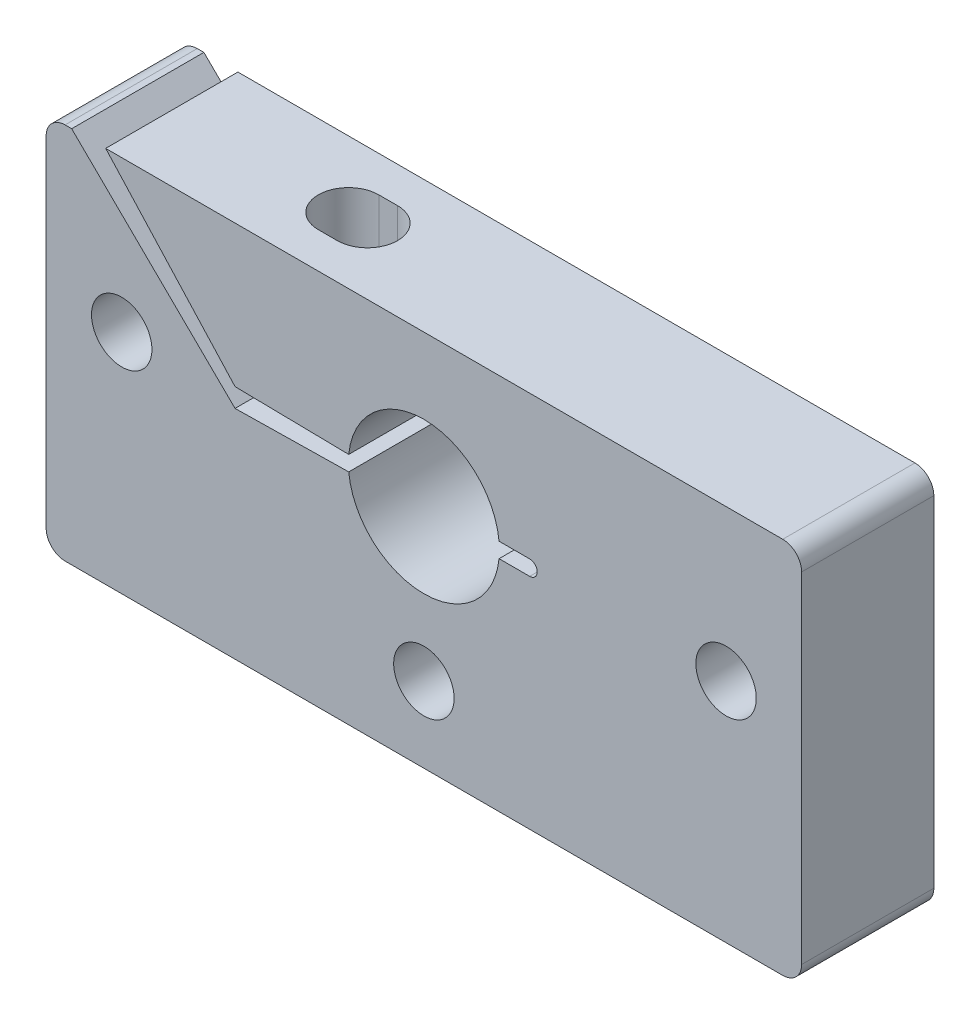
ISO-10303-21;
HEADER;
FILE_DESCRIPTION(('STEP AP214'),'2;1');
FILE_NAME('part.step','',(''),(''),'','','');
FILE_SCHEMA(('AUTOMOTIVE_DESIGN { 1 0 10303 214 1 1 1 1 }'));
ENDSEC;
DATA;
#1=APPLICATION_CONTEXT('core data for automotive mechanical design processes');
#2=APPLICATION_PROTOCOL_DEFINITION('international standard','automotive_design',2000,#1);
#3=PRODUCT_CONTEXT('',#1,'mechanical');
#4=PRODUCT('Part','Part','',(#3));
#5=PRODUCT_RELATED_PRODUCT_CATEGORY('part','',(#4));
#6=PRODUCT_DEFINITION_FORMATION('','',#4);
#7=PRODUCT_DEFINITION_CONTEXT('part definition',#1,'design');
#8=PRODUCT_DEFINITION('design','',#6,#7);
#9=PRODUCT_DEFINITION_SHAPE('','',#8);
#10=(LENGTH_UNIT() NAMED_UNIT(*) SI_UNIT(.MILLI.,.METRE.));
#11=(NAMED_UNIT(*) PLANE_ANGLE_UNIT() SI_UNIT($,.RADIAN.));
#12=(NAMED_UNIT(*) SI_UNIT($,.STERADIAN.) SOLID_ANGLE_UNIT());
#13=UNCERTAINTY_MEASURE_WITH_UNIT(LENGTH_MEASURE(1.E-05),#10,'distance_accuracy_value','');
#14=(GEOMETRIC_REPRESENTATION_CONTEXT(3) GLOBAL_UNCERTAINTY_ASSIGNED_CONTEXT((#13)) GLOBAL_UNIT_ASSIGNED_CONTEXT((#10,
#11,#12)) REPRESENTATION_CONTEXT('',''));
#15=CARTESIAN_POINT('',(0.,0.,0.));
#16=DIRECTION('',(0.,0.,1.));
#17=DIRECTION('',(1.,0.,0.));
#18=AXIS2_PLACEMENT_3D('',#15,#16,#17);
#19=CARTESIAN_POINT('',(5.6,0.,-3.5));
#20=DIRECTION('',(0.,0.,1.));
#21=DIRECTION('',(1.,0.,0.));
#22=AXIS2_PLACEMENT_3D('',#19,#20,#21);
#23=CYLINDRICAL_SURFACE('',#22,0.4);
#24=DIRECTION('',(0.,0.,-1.));
#25=VECTOR('',#24,1.);
#26=CARTESIAN_POINT('',(5.6,0.4,-3.5));
#27=LINE('',#26,#25);
#28=CARTESIAN_POINT('',(5.6,0.4,-3.5));
#29=VERTEX_POINT('',#28);
#30=CARTESIAN_POINT('',(5.6,0.4,3.5));
#31=VERTEX_POINT('',#30);
#32=EDGE_CURVE('E426',#29,#31,#27,.F.);
#33=ORIENTED_EDGE('',*,*,#32,.F.);
#34=CARTESIAN_POINT('',(5.6,0.,-3.5));
#35=DIRECTION('',(0.,0.,1.));
#36=DIRECTION('',(1.,0.,0.));
#37=AXIS2_PLACEMENT_3D('',#34,#35,#36);
#38=CIRCLE('',#37,0.4);
#39=CARTESIAN_POINT('',(5.6,-0.4,-3.5));
#40=VERTEX_POINT('',#39);
#41=EDGE_CURVE('E93',#29,#40,#38,.F.);
#42=ORIENTED_EDGE('',*,*,#41,.T.);
#43=DIRECTION('',(0.,0.,-1.));
#44=VECTOR('',#43,1.);
#45=CARTESIAN_POINT('',(5.6,-0.4,-3.5));
#46=LINE('',#45,#44);
#47=CARTESIAN_POINT('',(5.6,-0.4,3.5));
#48=VERTEX_POINT('',#47);
#49=EDGE_CURVE('E431',#48,#40,#46,.T.);
#50=ORIENTED_EDGE('',*,*,#49,.F.);
#51=CARTESIAN_POINT('',(5.6,0.,3.5));
#52=DIRECTION('',(0.,0.,1.));
#53=DIRECTION('',(1.,0.,0.));
#54=AXIS2_PLACEMENT_3D('',#51,#52,#53);
#55=CIRCLE('',#54,0.4);
#56=EDGE_CURVE('E12',#48,#31,#55,.T.);
#57=ORIENTED_EDGE('',*,*,#56,.T.);
#58=EDGE_LOOP('',(#33,#42,#50,#57));
#59=FACE_BOUND('',#58,.T.);
#60=ADVANCED_FACE('F82',(#59),#23,.F.);
#61=CARTESIAN_POINT('',(-6.98997487421324,8.001,0.));
#62=DIRECTION('',(0.,-1.,0.));
#63=DIRECTION('',(0.,0.,-1.));
#64=AXIS2_PLACEMENT_3D('',#61,#62,#63);
#65=CYLINDRICAL_SURFACE('',#64,1.6);
#66=CARTESIAN_POINT('',(-6.98997487421324,-0.450000000000001,0.));
#67=DIRECTION('',(-0.0166088657318921,0.99986206327628,0.));
#68=DIRECTION('',(-0.99986206327628,-0.0166088657318921,0.));
#69=AXIS2_PLACEMENT_3D('',#66,#67,#68);
#70=ELLIPSE('',#69,1.60022072920462,1.6);
#71=CARTESIAN_POINT('',(-8.58997487421324,-0.476577851232751,0.));
#72=VERTEX_POINT('',#71);
#73=EDGE_CURVE('E277',#72,#72,#70,.F.);
#74=ORIENTED_EDGE('',*,*,#73,.F.);
#75=EDGE_LOOP('',(#74));
#76=FACE_BOUND('',#75,.T.);
#77=CARTESIAN_POINT('',(-6.98997487421324,-6.,0.));
#78=DIRECTION('',(0.,-1.,0.));
#79=DIRECTION('',(0.,0.,-1.));
#80=AXIS2_PLACEMENT_3D('',#77,#78,#79);
#81=CIRCLE('',#80,1.6);
#82=CARTESIAN_POINT('',(-6.98997487421324,-6.,-1.6));
#83=VERTEX_POINT('',#82);
#84=EDGE_CURVE('E249',#83,#83,#81,.T.);
#85=ORIENTED_EDGE('',*,*,#84,.T.);
#86=EDGE_LOOP('',(#85));
#87=FACE_BOUND('',#86,.T.);
#88=ADVANCED_FACE('F508',(#76,#87),#65,.F.);
#89=CARTESIAN_POINT('',(0.,0.,-3.5));
#90=DIRECTION('',(0.,0.,1.));
#91=DIRECTION('',(1.,0.,0.));
#92=AXIS2_PLACEMENT_3D('',#89,#90,#91);
#93=CYLINDRICAL_SURFACE('',#92,4.);
#94=DIRECTION('',(0.,0.,1.));
#95=VECTOR('',#94,1.);
#96=CARTESIAN_POINT('',(3.97994974842648,0.4,-3.5));
#97=LINE('',#96,#95);
#98=CARTESIAN_POINT('',(3.97994974842648,0.4,-3.5));
#99=VERTEX_POINT('',#98);
#100=CARTESIAN_POINT('',(3.97994974842648,0.4,3.5));
#101=VERTEX_POINT('',#100);
#102=EDGE_CURVE('E372',#99,#101,#97,.T.);
#103=ORIENTED_EDGE('',*,*,#102,.T.);
#104=CARTESIAN_POINT('',(0.,0.,3.5));
#105=DIRECTION('',(0.,0.,-1.));
#106=DIRECTION('',(1.,0.,0.));
#107=AXIS2_PLACEMENT_3D('',#104,#105,#106);
#108=CIRCLE('',#107,4.);
#109=CARTESIAN_POINT('',(-3.97994974842648,0.4,3.5));
#110=VERTEX_POINT('',#109);
#111=EDGE_CURVE('E292',#110,#101,#108,.T.);
#112=ORIENTED_EDGE('',*,*,#111,.F.);
#113=DIRECTION('',(0.,0.,1.));
#114=VECTOR('',#113,1.);
#115=CARTESIAN_POINT('',(-3.97994974842648,0.4,-3.5));
#116=LINE('',#115,#114);
#117=CARTESIAN_POINT('',(-3.97994974842648,0.4,-3.5));
#118=VERTEX_POINT('',#117);
#119=EDGE_CURVE('E374',#118,#110,#116,.T.);
#120=ORIENTED_EDGE('',*,*,#119,.F.);
#121=CARTESIAN_POINT('',(0.,0.,-3.5));
#122=DIRECTION('',(0.,0.,-1.));
#123=DIRECTION('',(1.,0.,0.));
#124=AXIS2_PLACEMENT_3D('',#121,#122,#123);
#125=CIRCLE('',#124,4.);
#126=EDGE_CURVE('E340',#118,#99,#125,.T.);
#127=ORIENTED_EDGE('',*,*,#126,.T.);
#128=EDGE_LOOP('',(#103,#112,#120,#127));
#129=FACE_BOUND('',#128,.T.);
#130=ADVANCED_FACE('F502',(#129),#93,.F.);
#131=CARTESIAN_POINT('',(-10.,0.5,-3.5));
#132=DIRECTION('',(-0.0166088657318921,-0.99986206327628,0.));
#133=DIRECTION('',(0.99986206327628,-0.0166088657318921,0.));
#134=AXIS2_PLACEMENT_3D('',#131,#132,#133);
#135=PLANE('',#134);
#136=CARTESIAN_POINT('',(-7.48997487421324,0.458305578510235,0.));
#137=DIRECTION('',(-0.0166088657318921,-0.99986206327628,0.));
#138=DIRECTION('',(-0.99986206327628,0.0166088657318921,0.));
#139=AXIS2_PLACEMENT_3D('',#136,#137,#138);
#140=ELLIPSE('',#139,1.60022072920462,1.6);
#141=CARTESIAN_POINT('',(-7.48997487421324,0.458305578510237,-1.6));
#142=VERTEX_POINT('',#141);
#143=CARTESIAN_POINT('',(-7.48997487421324,0.458305578510237,1.6));
#144=VERTEX_POINT('',#143);
#145=EDGE_CURVE('E236',#142,#144,#140,.F.);
#146=ORIENTED_EDGE('',*,*,#145,.T.);
#147=DIRECTION('',(0.99986206327628,-0.0166088657318921,0.));
#148=VECTOR('',#147,1.);
#149=CARTESIAN_POINT('',(-7.28306848467389,0.45486862398506,1.6));
#150=LINE('',#149,#148);
#151=CARTESIAN_POINT('',(-6.48997487421324,0.441694421489766,1.6));
#152=VERTEX_POINT('',#151);
#153=EDGE_CURVE('E262',#144,#152,#150,.T.);
#154=ORIENTED_EDGE('',*,*,#153,.T.);
#155=CARTESIAN_POINT('',(-6.48997487421324,0.441694421489768,0.));
#156=DIRECTION('',(-0.0166088657318921,-0.99986206327628,0.));
#157=DIRECTION('',(-0.99986206327628,0.0166088657318921,0.));
#158=AXIS2_PLACEMENT_3D('',#155,#156,#157);
#159=ELLIPSE('',#158,1.60022072920462,1.6);
#160=CARTESIAN_POINT('',(-6.48997487421324,0.441694421489768,-1.6));
#161=VERTEX_POINT('',#160);
#162=EDGE_CURVE('E237',#152,#161,#159,.F.);
#163=ORIENTED_EDGE('',*,*,#162,.T.);
#164=DIRECTION('',(-0.99986206327628,0.0166088657318921,0.));
#165=VECTOR('',#164,1.);
#166=CARTESIAN_POINT('',(-7.28306848467389,0.45486862398506,-1.6));
#167=LINE('',#166,#165);
#168=EDGE_CURVE('E239',#161,#142,#167,.T.);
#169=ORIENTED_EDGE('',*,*,#168,.T.);
#170=EDGE_LOOP('',(#146,#154,#163,#169));
#171=FACE_BOUND('',#170,.T.);
#172=ORIENTED_EDGE('',*,*,#119,.T.);
#173=DIRECTION('',(0.99986206327628,-0.0166088657318921,0.));
#174=VECTOR('',#173,1.);
#175=CARTESIAN_POINT('',(-10.,0.5,3.5));
#176=LINE('',#175,#174);
#177=CARTESIAN_POINT('',(-10.,0.5,3.5));
#178=VERTEX_POINT('',#177);
#179=EDGE_CURVE('E324',#178,#110,#176,.T.);
#180=ORIENTED_EDGE('',*,*,#179,.F.);
#181=DIRECTION('',(0.,0.,1.));
#182=VECTOR('',#181,1.);
#183=CARTESIAN_POINT('',(-10.,0.5,-3.5));
#184=LINE('',#183,#182);
#185=CARTESIAN_POINT('',(-10.,0.5,-3.5));
#186=VERTEX_POINT('',#185);
#187=EDGE_CURVE('E377',#186,#178,#184,.T.);
#188=ORIENTED_EDGE('',*,*,#187,.F.);
#189=DIRECTION('',(0.99986206327628,-0.0166088657318921,0.));
#190=VECTOR('',#189,1.);
#191=CARTESIAN_POINT('',(-10.,0.5,-3.5));
#192=LINE('',#191,#190);
#193=EDGE_CURVE('E371',#186,#118,#192,.T.);
#194=ORIENTED_EDGE('',*,*,#193,.T.);
#195=EDGE_LOOP('',(#172,#180,#188,#194));
#196=FACE_BOUND('',#195,.T.);
#197=ADVANCED_FACE('F499',(#171,#196),#135,.T.);
#198=CARTESIAN_POINT('',(-10.,0.5,-3.5));
#199=DIRECTION('',(-0.73845534062588,-0.674302387583728,0.));
#200=DIRECTION('',(0.674302387583728,-0.73845534062588,0.));
#201=AXIS2_PLACEMENT_3D('',#198,#199,#200);
#202=PLANE('',#201);
#203=ORIENTED_EDGE('',*,*,#187,.T.);
#204=DIRECTION('',(0.674302387583728,-0.73845534062588,0.));
#205=VECTOR('',#204,1.);
#206=CARTESIAN_POINT('',(-10.,0.5,3.5));
#207=LINE('',#206,#205);
#208=CARTESIAN_POINT('',(-16.8484411021954,8.,3.5));
#209=VERTEX_POINT('',#208);
#210=EDGE_CURVE('E325',#209,#178,#207,.T.);
#211=ORIENTED_EDGE('',*,*,#210,.F.);
#212=DIRECTION('',(0.,0.,1.));
#213=VECTOR('',#212,1.);
#214=CARTESIAN_POINT('',(-16.8484411021954,8.,-3.5));
#215=LINE('',#214,#213);
#216=CARTESIAN_POINT('',(-16.8484411021954,8.,-3.5));
#217=VERTEX_POINT('',#216);
#218=EDGE_CURVE('E379',#217,#209,#215,.T.);
#219=ORIENTED_EDGE('',*,*,#218,.F.);
#220=DIRECTION('',(0.674302387583728,-0.73845534062588,0.));
#221=VECTOR('',#220,1.);
#222=CARTESIAN_POINT('',(-10.,0.5,-3.5));
#223=LINE('',#222,#221);
#224=EDGE_CURVE('E368',#217,#186,#223,.T.);
#225=ORIENTED_EDGE('',*,*,#224,.T.);
#226=EDGE_LOOP('',(#203,#211,#219,#225));
#227=FACE_BOUND('',#226,.T.);
#228=ADVANCED_FACE('F496',(#227),#202,.T.);
#229=CARTESIAN_POINT('',(-16.8484411021954,8.,-3.5));
#230=DIRECTION('',(0.,1.,0.));
#231=DIRECTION('',(-1.,0.,0.));
#232=AXIS2_PLACEMENT_3D('',#229,#230,#231);
#233=PLANE('',#232);
#234=CARTESIAN_POINT('',(-7.48997487421324,8.,0.));
#235=DIRECTION('',(0.,1.,0.));
#236=DIRECTION('',(0.,0.,1.));
#237=AXIS2_PLACEMENT_3D('',#234,#235,#236);
#238=CIRCLE('',#237,1.6);
#239=CARTESIAN_POINT('',(-7.48997487421324,8.,-1.6));
#240=VERTEX_POINT('',#239);
#241=CARTESIAN_POINT('',(-7.48997487421324,8.,1.6));
#242=VERTEX_POINT('',#241);
#243=EDGE_CURVE('E231',#240,#242,#238,.T.);
#244=ORIENTED_EDGE('',*,*,#243,.F.);
#245=DIRECTION('',(-1.,0.,0.));
#246=VECTOR('',#245,1.);
#247=CARTESIAN_POINT('',(-7.48997487421324,8.,-1.6));
#248=LINE('',#247,#246);
#249=CARTESIAN_POINT('',(-6.48997487421324,8.,-1.6));
#250=VERTEX_POINT('',#249);
#251=EDGE_CURVE('E243',#250,#240,#248,.T.);
#252=ORIENTED_EDGE('',*,*,#251,.F.);
#253=CARTESIAN_POINT('',(-6.48997487421324,8.,0.));
#254=DIRECTION('',(0.,1.,0.));
#255=DIRECTION('',(0.,0.,1.));
#256=AXIS2_PLACEMENT_3D('',#253,#254,#255);
#257=CIRCLE('',#256,1.6);
#258=CARTESIAN_POINT('',(-6.48997487421324,8.,1.6));
#259=VERTEX_POINT('',#258);
#260=EDGE_CURVE('E252',#259,#250,#257,.T.);
#261=ORIENTED_EDGE('',*,*,#260,.F.);
#262=DIRECTION('',(1.,0.,0.));
#263=VECTOR('',#262,1.);
#264=CARTESIAN_POINT('',(-7.48997487421324,8.,1.6));
#265=LINE('',#264,#263);
#266=EDGE_CURVE('E260',#242,#259,#265,.T.);
#267=ORIENTED_EDGE('',*,*,#266,.F.);
#268=EDGE_LOOP('',(#244,#252,#261,#267));
#269=FACE_BOUND('',#268,.T.);
#270=DIRECTION('',(-1.,0.,0.));
#271=VECTOR('',#270,1.);
#272=CARTESIAN_POINT('',(-16.8484411021954,8.,3.5));
#273=LINE('',#272,#271);
#274=CARTESIAN_POINT('',(19.,8.,3.5));
#275=VERTEX_POINT('',#274);
#276=EDGE_CURVE('E318',#275,#209,#273,.T.);
#277=ORIENTED_EDGE('',*,*,#276,.F.);
#278=DIRECTION('',(0.,0.,1.));
#279=VECTOR('',#278,1.);
#280=CARTESIAN_POINT('',(19.,8.,-3.5));
#281=LINE('',#280,#279);
#282=CARTESIAN_POINT('',(19.,8.,-3.5));
#283=VERTEX_POINT('',#282);
#284=EDGE_CURVE('E421',#275,#283,#281,.F.);
#285=ORIENTED_EDGE('',*,*,#284,.T.);
#286=DIRECTION('',(-1.,0.,0.));
#287=VECTOR('',#286,1.);
#288=CARTESIAN_POINT('',(-16.8484411021954,8.,-3.5));
#289=LINE('',#288,#287);
#290=EDGE_CURVE('E366',#283,#217,#289,.T.);
#291=ORIENTED_EDGE('',*,*,#290,.T.);
#292=ORIENTED_EDGE('',*,*,#218,.T.);
#293=EDGE_LOOP('',(#277,#285,#291,#292));
#294=FACE_BOUND('',#293,.T.);
#295=ADVANCED_FACE('F251',(#269,#294),#233,.T.);
#296=CARTESIAN_POINT('',(20.,8.,-3.5));
#297=DIRECTION('',(1.,0.,0.));
#298=DIRECTION('',(0.,1.,0.));
#299=AXIS2_PLACEMENT_3D('',#296,#297,#298);
#300=PLANE('',#299);
#301=DIRECTION('',(0.,1.,0.));
#302=VECTOR('',#301,1.);
#303=CARTESIAN_POINT('',(20.,8.,3.5));
#304=LINE('',#303,#302);
#305=CARTESIAN_POINT('',(20.,-11.,3.5));
#306=VERTEX_POINT('',#305);
#307=CARTESIAN_POINT('',(20.,7.,3.5));
#308=VERTEX_POINT('',#307);
#309=EDGE_CURVE('E320',#306,#308,#304,.T.);
#310=ORIENTED_EDGE('',*,*,#309,.F.);
#311=DIRECTION('',(0.,0.,1.));
#312=VECTOR('',#311,1.);
#313=CARTESIAN_POINT('',(20.,-11.,-3.5));
#314=LINE('',#313,#312);
#315=CARTESIAN_POINT('',(20.,-11.,-3.5));
#316=VERTEX_POINT('',#315);
#317=EDGE_CURVE('E423',#306,#316,#314,.F.);
#318=ORIENTED_EDGE('',*,*,#317,.T.);
#319=DIRECTION('',(0.,1.,0.));
#320=VECTOR('',#319,1.);
#321=CARTESIAN_POINT('',(20.,8.,-3.5));
#322=LINE('',#321,#320);
#323=CARTESIAN_POINT('',(20.,7.,-3.5));
#324=VERTEX_POINT('',#323);
#325=EDGE_CURVE('E361',#316,#324,#322,.T.);
#326=ORIENTED_EDGE('',*,*,#325,.T.);
#327=DIRECTION('',(0.,0.,1.));
#328=VECTOR('',#327,1.);
#329=CARTESIAN_POINT('',(20.,7.,-3.5));
#330=LINE('',#329,#328);
#331=EDGE_CURVE('E416',#324,#308,#330,.T.);
#332=ORIENTED_EDGE('',*,*,#331,.T.);
#333=EDGE_LOOP('',(#310,#318,#326,#332));
#334=FACE_BOUND('',#333,.T.);
#335=ADVANCED_FACE('F481',(#334),#300,.T.);
#336=CARTESIAN_POINT('',(-20.,-12.,-3.5));
#337=DIRECTION('',(0.,-1.,0.));
#338=DIRECTION('',(1.,0.,0.));
#339=AXIS2_PLACEMENT_3D('',#336,#337,#338);
#340=PLANE('',#339);
#341=CARTESIAN_POINT('',(-6.98997487421324,-12.,0.));
#342=DIRECTION('',(0.,-1.,0.));
#343=DIRECTION('',(0.,0.,-1.));
#344=AXIS2_PLACEMENT_3D('',#341,#342,#343);
#345=CIRCLE('',#344,2.2);
#346=CARTESIAN_POINT('',(-6.98997487421324,-12.,-2.2));
#347=VERTEX_POINT('',#346);
#348=EDGE_CURVE('E274',#347,#347,#345,.T.);
#349=ORIENTED_EDGE('',*,*,#348,.F.);
#350=EDGE_LOOP('',(#349));
#351=FACE_BOUND('',#350,.T.);
#352=DIRECTION('',(1.,0.,0.));
#353=VECTOR('',#352,1.);
#354=CARTESIAN_POINT('',(-20.,-12.,3.5));
#355=LINE('',#354,#353);
#356=CARTESIAN_POINT('',(-19.,-12.,3.5));
#357=VERTEX_POINT('',#356);
#358=CARTESIAN_POINT('',(19.,-12.,3.5));
#359=VERTEX_POINT('',#358);
#360=EDGE_CURVE('E313',#357,#359,#355,.T.);
#361=ORIENTED_EDGE('',*,*,#360,.F.);
#362=DIRECTION('',(0.,0.,1.));
#363=VECTOR('',#362,1.);
#364=CARTESIAN_POINT('',(-19.,-12.,-3.5));
#365=LINE('',#364,#363);
#366=CARTESIAN_POINT('',(-19.,-12.,-3.5));
#367=VERTEX_POINT('',#366);
#368=EDGE_CURVE('E407',#357,#367,#365,.F.);
#369=ORIENTED_EDGE('',*,*,#368,.T.);
#370=DIRECTION('',(1.,0.,0.));
#371=VECTOR('',#370,1.);
#372=CARTESIAN_POINT('',(-20.,-12.,-3.5));
#373=LINE('',#372,#371);
#374=CARTESIAN_POINT('',(19.,-12.,-3.5));
#375=VERTEX_POINT('',#374);
#376=EDGE_CURVE('E359',#367,#375,#373,.T.);
#377=ORIENTED_EDGE('',*,*,#376,.T.);
#378=DIRECTION('',(0.,0.,1.));
#379=VECTOR('',#378,1.);
#380=CARTESIAN_POINT('',(19.,-12.,-3.5));
#381=LINE('',#380,#379);
#382=EDGE_CURVE('E403',#375,#359,#381,.T.);
#383=ORIENTED_EDGE('',*,*,#382,.T.);
#384=EDGE_LOOP('',(#361,#369,#377,#383));
#385=FACE_BOUND('',#384,.T.);
#386=ADVANCED_FACE('F474',(#351,#385),#340,.T.);
#387=CARTESIAN_POINT('',(-20.,8.,-3.5));
#388=DIRECTION('',(-1.,0.,0.));
#389=DIRECTION('',(0.,-1.,0.));
#390=AXIS2_PLACEMENT_3D('',#387,#388,#389);
#391=PLANE('',#390);
#392=DIRECTION('',(0.,-1.,0.));
#393=VECTOR('',#392,1.);
#394=CARTESIAN_POINT('',(-20.,8.,-3.5));
#395=LINE('',#394,#393);
#396=CARTESIAN_POINT('',(-20.,7.,-3.5));
#397=VERTEX_POINT('',#396);
#398=CARTESIAN_POINT('',(-20.,-11.,-3.5));
#399=VERTEX_POINT('',#398);
#400=EDGE_CURVE('E357',#397,#399,#395,.T.);
#401=ORIENTED_EDGE('',*,*,#400,.T.);
#402=DIRECTION('',(0.,0.,1.));
#403=VECTOR('',#402,1.);
#404=CARTESIAN_POINT('',(-20.,-11.,-3.5));
#405=LINE('',#404,#403);
#406=CARTESIAN_POINT('',(-20.,-11.,3.5));
#407=VERTEX_POINT('',#406);
#408=EDGE_CURVE('E391',#399,#407,#405,.T.);
#409=ORIENTED_EDGE('',*,*,#408,.T.);
#410=DIRECTION('',(0.,-1.,0.));
#411=VECTOR('',#410,1.);
#412=CARTESIAN_POINT('',(-20.,8.,3.5));
#413=LINE('',#412,#411);
#414=CARTESIAN_POINT('',(-20.,7.,3.5));
#415=VERTEX_POINT('',#414);
#416=EDGE_CURVE('E311',#415,#407,#413,.T.);
#417=ORIENTED_EDGE('',*,*,#416,.F.);
#418=DIRECTION('',(0.,0.,1.));
#419=VECTOR('',#418,1.);
#420=CARTESIAN_POINT('',(-20.,7.,-3.5));
#421=LINE('',#420,#419);
#422=EDGE_CURVE('E380',#415,#397,#421,.F.);
#423=ORIENTED_EDGE('',*,*,#422,.T.);
#424=EDGE_LOOP('',(#401,#409,#417,#423));
#425=FACE_BOUND('',#424,.T.);
#426=ADVANCED_FACE('F470',(#425),#391,.T.);
#427=CARTESIAN_POINT('',(-20.,8.,-3.5));
#428=DIRECTION('',(0.,1.,0.));
#429=DIRECTION('',(0.,0.,1.));
#430=AXIS2_PLACEMENT_3D('',#427,#428,#429);
#431=PLANE('',#430);
#432=DIRECTION('',(-1.,0.,0.));
#433=VECTOR('',#432,1.);
#434=CARTESIAN_POINT('',(-20.,8.,-3.5));
#435=LINE('',#434,#433);
#436=CARTESIAN_POINT('',(-18.6496628402632,8.,-3.5));
#437=VERTEX_POINT('',#436);
#438=CARTESIAN_POINT('',(-19.,8.,-3.5));
#439=VERTEX_POINT('',#438);
#440=EDGE_CURVE('E352',#437,#439,#435,.T.);
#441=ORIENTED_EDGE('',*,*,#440,.T.);
#442=DIRECTION('',(0.,0.,1.));
#443=VECTOR('',#442,1.);
#444=CARTESIAN_POINT('',(-19.,8.,-3.5));
#445=LINE('',#444,#443);
#446=CARTESIAN_POINT('',(-19.,8.,3.5));
#447=VERTEX_POINT('',#446);
#448=EDGE_CURVE('E424',#439,#447,#445,.T.);
#449=ORIENTED_EDGE('',*,*,#448,.T.);
#450=DIRECTION('',(-1.,0.,0.));
#451=VECTOR('',#450,1.);
#452=CARTESIAN_POINT('',(-20.,8.,3.5));
#453=LINE('',#452,#451);
#454=CARTESIAN_POINT('',(-18.6496628402632,8.,3.5));
#455=VERTEX_POINT('',#454);
#456=EDGE_CURVE('E308',#455,#447,#453,.T.);
#457=ORIENTED_EDGE('',*,*,#456,.F.);
#458=DIRECTION('',(0.,0.,1.));
#459=VECTOR('',#458,1.);
#460=CARTESIAN_POINT('',(-18.6496628402632,8.,-3.5));
#461=LINE('',#460,#459);
#462=EDGE_CURVE('E384',#437,#455,#461,.T.);
#463=ORIENTED_EDGE('',*,*,#462,.F.);
#464=EDGE_LOOP('',(#441,#449,#457,#463));
#465=FACE_BOUND('',#464,.T.);
#466=ADVANCED_FACE('F458',(#465),#431,.T.);
#467=CARTESIAN_POINT('',(-10.,-0.5,-3.5));
#468=DIRECTION('',(0.700909264299847,0.713250449154186,0.));
#469=DIRECTION('',(-0.713250449154186,0.700909264299847,0.));
#470=AXIS2_PLACEMENT_3D('',#467,#468,#469);
#471=PLANE('',#470);
#472=ORIENTED_EDGE('',*,*,#462,.T.);
#473=DIRECTION('',(-0.713250449154186,0.700909264299847,0.));
#474=VECTOR('',#473,1.);
#475=CARTESIAN_POINT('',(-10.,-0.5,3.5));
#476=LINE('',#475,#474);
#477=CARTESIAN_POINT('',(-10.,-0.5,3.5));
#478=VERTEX_POINT('',#477);
#479=EDGE_CURVE('E304',#478,#455,#476,.T.);
#480=ORIENTED_EDGE('',*,*,#479,.F.);
#481=DIRECTION('',(0.,0.,1.));
#482=VECTOR('',#481,1.);
#483=CARTESIAN_POINT('',(-10.,-0.5,-3.5));
#484=LINE('',#483,#482);
#485=CARTESIAN_POINT('',(-10.,-0.5,-3.5));
#486=VERTEX_POINT('',#485);
#487=EDGE_CURVE('E383',#486,#478,#484,.T.);
#488=ORIENTED_EDGE('',*,*,#487,.F.);
#489=DIRECTION('',(-0.713250449154186,0.700909264299847,0.));
#490=VECTOR('',#489,1.);
#491=CARTESIAN_POINT('',(-10.,-0.5,-3.5));
#492=LINE('',#491,#490);
#493=EDGE_CURVE('E353',#486,#437,#492,.T.);
#494=ORIENTED_EDGE('',*,*,#493,.T.);
#495=EDGE_LOOP('',(#472,#480,#488,#494));
#496=FACE_BOUND('',#495,.T.);
#497=ADVANCED_FACE('F453',(#496),#471,.T.);
#498=CARTESIAN_POINT('',(-10.,-0.5,-3.5));
#499=DIRECTION('',(-0.0166088657318921,0.99986206327628,0.));
#500=DIRECTION('',(-0.99986206327628,-0.0166088657318921,0.));
#501=AXIS2_PLACEMENT_3D('',#498,#499,#500);
#502=PLANE('',#501);
#503=ORIENTED_EDGE('',*,*,#73,.T.);
#504=EDGE_LOOP('',(#503));
#505=FACE_BOUND('',#504,.T.);
#506=ORIENTED_EDGE('',*,*,#487,.T.);
#507=DIRECTION('',(-0.99986206327628,-0.0166088657318921,0.));
#508=VECTOR('',#507,1.);
#509=CARTESIAN_POINT('',(-10.,-0.5,3.5));
#510=LINE('',#509,#508);
#511=CARTESIAN_POINT('',(-3.97994974842648,-0.399999999999999,3.5));
#512=VERTEX_POINT('',#511);
#513=EDGE_CURVE('E305',#512,#478,#510,.T.);
#514=ORIENTED_EDGE('',*,*,#513,.F.);
#515=DIRECTION('',(0.,0.,1.));
#516=VECTOR('',#515,1.);
#517=CARTESIAN_POINT('',(-3.97994974842648,-0.399999999999999,-3.5));
#518=LINE('',#517,#516);
#519=CARTESIAN_POINT('',(-3.97994974842648,-0.399999999999999,-3.5));
#520=VERTEX_POINT('',#519);
#521=EDGE_CURVE('E390',#520,#512,#518,.T.);
#522=ORIENTED_EDGE('',*,*,#521,.F.);
#523=DIRECTION('',(-0.99986206327628,-0.0166088657318921,0.));
#524=VECTOR('',#523,1.);
#525=CARTESIAN_POINT('',(-10.,-0.5,-3.5));
#526=LINE('',#525,#524);
#527=EDGE_CURVE('E350',#520,#486,#526,.T.);
#528=ORIENTED_EDGE('',*,*,#527,.T.);
#529=EDGE_LOOP('',(#506,#514,#522,#528));
#530=FACE_BOUND('',#529,.T.);
#531=ADVANCED_FACE('F455',(#505,#530),#502,.T.);
#532=CARTESIAN_POINT('',(0.,0.,-3.5));
#533=DIRECTION('',(0.,0.,1.));
#534=DIRECTION('',(1.,0.,0.));
#535=AXIS2_PLACEMENT_3D('',#532,#533,#534);
#536=CYLINDRICAL_SURFACE('',#535,4.);
#537=ORIENTED_EDGE('',*,*,#521,.T.);
#538=CARTESIAN_POINT('',(0.,0.,3.5));
#539=DIRECTION('',(0.,0.,-1.));
#540=DIRECTION('',(1.,0.,0.));
#541=AXIS2_PLACEMENT_3D('',#538,#539,#540);
#542=CIRCLE('',#541,4.);
#543=CARTESIAN_POINT('',(3.97994974842648,-0.4,3.5));
#544=VERTEX_POINT('',#543);
#545=EDGE_CURVE('E299',#544,#512,#542,.T.);
#546=ORIENTED_EDGE('',*,*,#545,.F.);
#547=DIRECTION('',(0.,0.,1.));
#548=VECTOR('',#547,1.);
#549=CARTESIAN_POINT('',(3.97994974842648,-0.4,-3.5));
#550=LINE('',#549,#548);
#551=CARTESIAN_POINT('',(3.97994974842648,-0.4,-3.5));
#552=VERTEX_POINT('',#551);
#553=EDGE_CURVE('E388',#552,#544,#550,.T.);
#554=ORIENTED_EDGE('',*,*,#553,.F.);
#555=CARTESIAN_POINT('',(0.,0.,-3.5));
#556=DIRECTION('',(0.,0.,-1.));
#557=DIRECTION('',(1.,0.,0.));
#558=AXIS2_PLACEMENT_3D('',#555,#556,#557);
#559=CIRCLE('',#558,4.);
#560=EDGE_CURVE('E344',#552,#520,#559,.T.);
#561=ORIENTED_EDGE('',*,*,#560,.T.);
#562=EDGE_LOOP('',(#537,#546,#554,#561));
#563=FACE_BOUND('',#562,.T.);
#564=ADVANCED_FACE('F444',(#563),#536,.F.);
#565=CARTESIAN_POINT('',(3.97994974842648,-0.4,-3.5));
#566=DIRECTION('',(0.,1.,0.));
#567=DIRECTION('',(0.,0.,1.));
#568=AXIS2_PLACEMENT_3D('',#565,#566,#567);
#569=PLANE('',#568);
#570=DIRECTION('',(-1.,0.,0.));
#571=VECTOR('',#570,1.);
#572=CARTESIAN_POINT('',(3.97994974842648,-0.4,3.5));
#573=LINE('',#572,#571);
#574=EDGE_CURVE('E300',#48,#544,#573,.T.);
#575=ORIENTED_EDGE('',*,*,#574,.F.);
#576=ORIENTED_EDGE('',*,*,#49,.T.);
#577=DIRECTION('',(-1.,0.,0.));
#578=VECTOR('',#577,1.);
#579=CARTESIAN_POINT('',(3.97994974842648,-0.4,-3.5));
#580=LINE('',#579,#578);
#581=EDGE_CURVE('E342',#40,#552,#580,.T.);
#582=ORIENTED_EDGE('',*,*,#581,.T.);
#583=ORIENTED_EDGE('',*,*,#553,.T.);
#584=EDGE_LOOP('',(#575,#576,#582,#583));
#585=FACE_BOUND('',#584,.T.);
#586=ADVANCED_FACE('F434',(#585),#569,.T.);
#587=CARTESIAN_POINT('',(3.97994974842648,0.4,-3.5));
#588=DIRECTION('',(0.,-1.,0.));
#589=DIRECTION('',(0.,0.,-1.));
#590=AXIS2_PLACEMENT_3D('',#587,#588,#589);
#591=PLANE('',#590);
#592=DIRECTION('',(1.,0.,0.));
#593=VECTOR('',#592,1.);
#594=CARTESIAN_POINT('',(3.97994974842648,0.4,-3.5));
#595=LINE('',#594,#593);
#596=EDGE_CURVE('E338',#99,#29,#595,.T.);
#597=ORIENTED_EDGE('',*,*,#596,.T.);
#598=ORIENTED_EDGE('',*,*,#32,.T.);
#599=DIRECTION('',(1.,0.,0.));
#600=VECTOR('',#599,1.);
#601=CARTESIAN_POINT('',(3.97994974842648,0.4,3.5));
#602=LINE('',#601,#600);
#603=EDGE_CURVE('E294',#101,#31,#602,.T.);
#604=ORIENTED_EDGE('',*,*,#603,.F.);
#605=ORIENTED_EDGE('',*,*,#102,.F.);
#606=EDGE_LOOP('',(#597,#598,#604,#605));
#607=FACE_BOUND('',#606,.T.);
#608=ADVANCED_FACE('F506',(#607),#591,.T.);
#609=CARTESIAN_POINT('',(0.,0.,-3.5));
#610=DIRECTION('',(0.,0.,1.));
#611=DIRECTION('',(1.,0.,0.));
#612=AXIS2_PLACEMENT_3D('',#609,#610,#611);
#613=PLANE('',#612);
#614=CARTESIAN_POINT('',(0.,-8.,-3.5));
#615=DIRECTION('',(0.,0.,1.));
#616=DIRECTION('',(1.,0.,0.));
#617=AXIS2_PLACEMENT_3D('',#614,#615,#616);
#618=CIRCLE('',#617,1.6);
#619=CARTESIAN_POINT('',(1.6,-8.,-3.5));
#620=VERTEX_POINT('',#619);
#621=EDGE_CURVE('E330',#620,#620,#618,.T.);
#622=ORIENTED_EDGE('',*,*,#621,.T.);
#623=EDGE_LOOP('',(#622));
#624=FACE_BOUND('',#623,.T.);
#625=CARTESIAN_POINT('',(16.,0.,-3.5));
#626=DIRECTION('',(0.,0.,1.));
#627=DIRECTION('',(-1.,0.,0.));
#628=AXIS2_PLACEMENT_3D('',#625,#626,#627);
#629=CIRCLE('',#628,1.60000000000001);
#630=CARTESIAN_POINT('',(14.4,0.,-3.5));
#631=VERTEX_POINT('',#630);
#632=EDGE_CURVE('E332',#631,#631,#629,.T.);
#633=ORIENTED_EDGE('',*,*,#632,.T.);
#634=EDGE_LOOP('',(#633));
#635=FACE_BOUND('',#634,.T.);
#636=CARTESIAN_POINT('',(-16.,0.,-3.5));
#637=DIRECTION('',(0.,0.,1.));
#638=DIRECTION('',(1.,0.,0.));
#639=AXIS2_PLACEMENT_3D('',#636,#637,#638);
#640=CIRCLE('',#639,1.6);
#641=CARTESIAN_POINT('',(-14.4,0.,-3.5));
#642=VERTEX_POINT('',#641);
#643=EDGE_CURVE('E334',#642,#642,#640,.T.);
#644=ORIENTED_EDGE('',*,*,#643,.T.);
#645=EDGE_LOOP('',(#644));
#646=FACE_BOUND('',#645,.T.);
#647=ORIENTED_EDGE('',*,*,#376,.F.);
#648=CARTESIAN_POINT('',(-19.,-11.,-3.5));
#649=DIRECTION('',(0.,0.,1.));
#650=DIRECTION('',(1.,0.,0.));
#651=AXIS2_PLACEMENT_3D('',#648,#649,#650);
#652=CIRCLE('',#651,1.);
#653=EDGE_CURVE('E418',#367,#399,#652,.F.);
#654=ORIENTED_EDGE('',*,*,#653,.T.);
#655=ORIENTED_EDGE('',*,*,#400,.F.);
#656=CARTESIAN_POINT('',(-19.,7.,-3.5));
#657=DIRECTION('',(0.,0.,1.));
#658=DIRECTION('',(1.,0.,0.));
#659=AXIS2_PLACEMENT_3D('',#656,#657,#658);
#660=CIRCLE('',#659,1.);
#661=EDGE_CURVE('E409',#397,#439,#660,.F.);
#662=ORIENTED_EDGE('',*,*,#661,.T.);
#663=ORIENTED_EDGE('',*,*,#440,.F.);
#664=ORIENTED_EDGE('',*,*,#493,.F.);
#665=ORIENTED_EDGE('',*,*,#527,.F.);
#666=ORIENTED_EDGE('',*,*,#560,.F.);
#667=ORIENTED_EDGE('',*,*,#581,.F.);
#668=ORIENTED_EDGE('',*,*,#41,.F.);
#669=ORIENTED_EDGE('',*,*,#596,.F.);
#670=ORIENTED_EDGE('',*,*,#126,.F.);
#671=ORIENTED_EDGE('',*,*,#193,.F.);
#672=ORIENTED_EDGE('',*,*,#224,.F.);
#673=ORIENTED_EDGE('',*,*,#290,.F.);
#674=CARTESIAN_POINT('',(19.,7.,-3.5));
#675=DIRECTION('',(0.,0.,1.));
#676=DIRECTION('',(1.,0.,0.));
#677=AXIS2_PLACEMENT_3D('',#674,#675,#676);
#678=CIRCLE('',#677,1.);
#679=EDGE_CURVE('E414',#283,#324,#678,.F.);
#680=ORIENTED_EDGE('',*,*,#679,.T.);
#681=ORIENTED_EDGE('',*,*,#325,.F.);
#682=CARTESIAN_POINT('',(19.,-11.,-3.5));
#683=DIRECTION('',(0.,0.,1.));
#684=DIRECTION('',(1.,0.,0.));
#685=AXIS2_PLACEMENT_3D('',#682,#683,#684);
#686=CIRCLE('',#685,1.);
#687=EDGE_CURVE('E411',#316,#375,#686,.F.);
#688=ORIENTED_EDGE('',*,*,#687,.T.);
#689=EDGE_LOOP('',(#647,#654,#655,#662,#663,#664,#665,#666,#667,#668,#669,#670,#671,#672,#673,
#680,#681,#688));
#690=FACE_BOUND('',#689,.T.);
#691=ADVANCED_FACE('F439',(#624,#635,#646,#690),#613,.F.);
#692=CARTESIAN_POINT('',(-16.,0.,-3.5));
#693=DIRECTION('',(0.,0.,1.));
#694=DIRECTION('',(1.,0.,0.));
#695=AXIS2_PLACEMENT_3D('',#692,#693,#694);
#696=CYLINDRICAL_SURFACE('',#695,1.6);
#697=ORIENTED_EDGE('',*,*,#643,.F.);
#698=EDGE_LOOP('',(#697));
#699=FACE_BOUND('',#698,.T.);
#700=CARTESIAN_POINT('',(-16.,0.,3.5));
#701=DIRECTION('',(0.,0.,1.));
#702=DIRECTION('',(1.,0.,0.));
#703=AXIS2_PLACEMENT_3D('',#700,#701,#702);
#704=CIRCLE('',#703,1.6);
#705=CARTESIAN_POINT('',(-14.4,0.,3.5));
#706=VERTEX_POINT('',#705);
#707=EDGE_CURVE('E287',#706,#706,#704,.T.);
#708=ORIENTED_EDGE('',*,*,#707,.T.);
#709=EDGE_LOOP('',(#708));
#710=FACE_BOUND('',#709,.T.);
#711=ADVANCED_FACE('F537',(#699,#710),#696,.F.);
#712=CARTESIAN_POINT('',(16.,0.,-3.5));
#713=DIRECTION('',(0.,0.,1.));
#714=DIRECTION('',(1.,0.,0.));
#715=AXIS2_PLACEMENT_3D('',#712,#713,#714);
#716=CYLINDRICAL_SURFACE('',#715,1.60000000000001);
#717=ORIENTED_EDGE('',*,*,#632,.F.);
#718=EDGE_LOOP('',(#717));
#719=FACE_BOUND('',#718,.T.);
#720=CARTESIAN_POINT('',(16.,0.,3.5));
#721=DIRECTION('',(0.,0.,1.));
#722=DIRECTION('',(-1.,0.,0.));
#723=AXIS2_PLACEMENT_3D('',#720,#721,#722);
#724=CIRCLE('',#723,1.60000000000001);
#725=CARTESIAN_POINT('',(14.4,0.,3.5));
#726=VERTEX_POINT('',#725);
#727=EDGE_CURVE('E288',#726,#726,#724,.T.);
#728=ORIENTED_EDGE('',*,*,#727,.T.);
#729=EDGE_LOOP('',(#728));
#730=FACE_BOUND('',#729,.T.);
#731=ADVANCED_FACE('F534',(#719,#730),#716,.F.);
#732=CARTESIAN_POINT('',(0.,-8.,-3.5));
#733=DIRECTION('',(0.,0.,1.));
#734=DIRECTION('',(1.,0.,0.));
#735=AXIS2_PLACEMENT_3D('',#732,#733,#734);
#736=CYLINDRICAL_SURFACE('',#735,1.6);
#737=ORIENTED_EDGE('',*,*,#621,.F.);
#738=EDGE_LOOP('',(#737));
#739=FACE_BOUND('',#738,.T.);
#740=CARTESIAN_POINT('',(0.,-8.,3.5));
#741=DIRECTION('',(0.,0.,1.));
#742=DIRECTION('',(1.,0.,0.));
#743=AXIS2_PLACEMENT_3D('',#740,#741,#742);
#744=CIRCLE('',#743,1.6);
#745=CARTESIAN_POINT('',(1.6,-8.,3.5));
#746=VERTEX_POINT('',#745);
#747=EDGE_CURVE('E285',#746,#746,#744,.T.);
#748=ORIENTED_EDGE('',*,*,#747,.T.);
#749=EDGE_LOOP('',(#748));
#750=FACE_BOUND('',#749,.T.);
#751=ADVANCED_FACE('F532',(#739,#750),#736,.F.);
#752=CARTESIAN_POINT('',(0.,0.,3.5));
#753=DIRECTION('',(0.,0.,1.));
#754=DIRECTION('',(1.,0.,0.));
#755=AXIS2_PLACEMENT_3D('',#752,#753,#754);
#756=PLANE('',#755);
#757=ORIENTED_EDGE('',*,*,#56,.F.);
#758=ORIENTED_EDGE('',*,*,#574,.T.);
#759=ORIENTED_EDGE('',*,*,#545,.T.);
#760=ORIENTED_EDGE('',*,*,#513,.T.);
#761=ORIENTED_EDGE('',*,*,#479,.T.);
#762=ORIENTED_EDGE('',*,*,#456,.T.);
#763=CARTESIAN_POINT('',(-19.,7.,3.5));
#764=DIRECTION('',(0.,0.,1.));
#765=DIRECTION('',(1.,0.,0.));
#766=AXIS2_PLACEMENT_3D('',#763,#764,#765);
#767=CIRCLE('',#766,1.);
#768=EDGE_CURVE('E400',#447,#415,#767,.T.);
#769=ORIENTED_EDGE('',*,*,#768,.T.);
#770=ORIENTED_EDGE('',*,*,#416,.T.);
#771=CARTESIAN_POINT('',(-19.,-11.,3.5));
#772=DIRECTION('',(0.,0.,1.));
#773=DIRECTION('',(1.,0.,0.));
#774=AXIS2_PLACEMENT_3D('',#771,#772,#773);
#775=CIRCLE('',#774,1.);
#776=EDGE_CURVE('E401',#407,#357,#775,.T.);
#777=ORIENTED_EDGE('',*,*,#776,.T.);
#778=ORIENTED_EDGE('',*,*,#360,.T.);
#779=CARTESIAN_POINT('',(19.,-11.,3.5));
#780=DIRECTION('',(0.,0.,1.));
#781=DIRECTION('',(1.,0.,0.));
#782=AXIS2_PLACEMENT_3D('',#779,#780,#781);
#783=CIRCLE('',#782,1.);
#784=EDGE_CURVE('E402',#359,#306,#783,.T.);
#785=ORIENTED_EDGE('',*,*,#784,.T.);
#786=ORIENTED_EDGE('',*,*,#309,.T.);
#787=CARTESIAN_POINT('',(19.,7.,3.5));
#788=DIRECTION('',(0.,0.,1.));
#789=DIRECTION('',(1.,0.,0.));
#790=AXIS2_PLACEMENT_3D('',#787,#788,#789);
#791=CIRCLE('',#790,1.);
#792=EDGE_CURVE('E399',#308,#275,#791,.T.);
#793=ORIENTED_EDGE('',*,*,#792,.T.);
#794=ORIENTED_EDGE('',*,*,#276,.T.);
#795=ORIENTED_EDGE('',*,*,#210,.T.);
#796=ORIENTED_EDGE('',*,*,#179,.T.);
#797=ORIENTED_EDGE('',*,*,#111,.T.);
#798=ORIENTED_EDGE('',*,*,#603,.T.);
#799=EDGE_LOOP('',(#757,#758,#759,#760,#761,#762,#769,#770,#777,#778,#785,#786,#793,#794,#795,
#796,#797,#798));
#800=FACE_BOUND('',#799,.T.);
#801=ORIENTED_EDGE('',*,*,#727,.F.);
#802=EDGE_LOOP('',(#801));
#803=FACE_BOUND('',#802,.T.);
#804=ORIENTED_EDGE('',*,*,#707,.F.);
#805=EDGE_LOOP('',(#804));
#806=FACE_BOUND('',#805,.T.);
#807=ORIENTED_EDGE('',*,*,#747,.F.);
#808=EDGE_LOOP('',(#807));
#809=FACE_BOUND('',#808,.T.);
#810=ADVANCED_FACE('F449',(#800,#803,#806,#809),#756,.T.);
#811=CARTESIAN_POINT('',(-6.98997487421324,-6.,0.));
#812=DIRECTION('',(0.,-1.,0.));
#813=DIRECTION('',(0.,0.,-1.));
#814=AXIS2_PLACEMENT_3D('',#811,#812,#813);
#815=CYLINDRICAL_SURFACE('',#814,2.2);
#816=CARTESIAN_POINT('',(-6.98997487421324,-6.,0.));
#817=DIRECTION('',(0.,-1.,0.));
#818=DIRECTION('',(0.,0.,-1.));
#819=AXIS2_PLACEMENT_3D('',#816,#817,#818);
#820=CIRCLE('',#819,2.2);
#821=CARTESIAN_POINT('',(-6.98997487421324,-6.,-2.2));
#822=VERTEX_POINT('',#821);
#823=EDGE_CURVE('E273',#822,#822,#820,.T.);
#824=ORIENTED_EDGE('',*,*,#823,.F.);
#825=EDGE_LOOP('',(#824));
#826=FACE_BOUND('',#825,.T.);
#827=ORIENTED_EDGE('',*,*,#348,.T.);
#828=EDGE_LOOP('',(#827));
#829=FACE_BOUND('',#828,.T.);
#830=ADVANCED_FACE('F530',(#826,#829),#815,.F.);
#831=CARTESIAN_POINT('',(-6.98997487421324,-6.,0.));
#832=DIRECTION('',(0.,-1.,0.));
#833=DIRECTION('',(0.,0.,-1.));
#834=AXIS2_PLACEMENT_3D('',#831,#832,#833);
#835=PLANE('',#834);
#836=ORIENTED_EDGE('',*,*,#84,.F.);
#837=EDGE_LOOP('',(#836));
#838=FACE_BOUND('',#837,.T.);
#839=ORIENTED_EDGE('',*,*,#823,.T.);
#840=EDGE_LOOP('',(#839));
#841=FACE_BOUND('',#840,.T.);
#842=ADVANCED_FACE('F652',(#838,#841),#835,.T.);
#843=CARTESIAN_POINT('',(-7.48997487421324,-12.001,0.));
#844=DIRECTION('',(0.,1.,0.));
#845=DIRECTION('',(0.,0.,1.));
#846=AXIS2_PLACEMENT_3D('',#843,#844,#845);
#847=CYLINDRICAL_SURFACE('',#846,1.6);
#848=DIRECTION('',(0.,1.,0.));
#849=VECTOR('',#848,1.);
#850=CARTESIAN_POINT('',(-7.48997487421324,-12.001,-1.6));
#851=LINE('',#850,#849);
#852=EDGE_CURVE('E226',#142,#240,#851,.T.);
#853=ORIENTED_EDGE('',*,*,#852,.T.);
#854=ORIENTED_EDGE('',*,*,#243,.T.);
#855=DIRECTION('',(0.,1.,0.));
#856=VECTOR('',#855,1.);
#857=CARTESIAN_POINT('',(-7.48997487421324,-12.001,1.6));
#858=LINE('',#857,#856);
#859=EDGE_CURVE('E267',#144,#242,#858,.T.);
#860=ORIENTED_EDGE('',*,*,#859,.F.);
#861=ORIENTED_EDGE('',*,*,#145,.F.);
#862=EDGE_LOOP('',(#853,#854,#860,#861));
#863=FACE_BOUND('',#862,.T.);
#864=ADVANCED_FACE('F229',(#863),#847,.F.);
#865=CARTESIAN_POINT('',(-7.48997487421324,-12.001,-1.6));
#866=DIRECTION('',(0.,0.,-1.));
#867=DIRECTION('',(-1.,0.,0.));
#868=AXIS2_PLACEMENT_3D('',#865,#866,#867);
#869=PLANE('',#868);
#870=DIRECTION('',(0.,1.,0.));
#871=VECTOR('',#870,1.);
#872=CARTESIAN_POINT('',(-6.48997487421324,-12.001,-1.6));
#873=LINE('',#872,#871);
#874=EDGE_CURVE('E246',#161,#250,#873,.T.);
#875=ORIENTED_EDGE('',*,*,#874,.T.);
#876=ORIENTED_EDGE('',*,*,#251,.T.);
#877=ORIENTED_EDGE('',*,*,#852,.F.);
#878=ORIENTED_EDGE('',*,*,#168,.F.);
#879=EDGE_LOOP('',(#875,#876,#877,#878));
#880=FACE_BOUND('',#879,.T.);
#881=ADVANCED_FACE('F242',(#880),#869,.F.);
#882=CARTESIAN_POINT('',(-6.48997487421324,-12.001,0.));
#883=DIRECTION('',(0.,1.,0.));
#884=DIRECTION('',(0.,0.,1.));
#885=AXIS2_PLACEMENT_3D('',#882,#883,#884);
#886=CYLINDRICAL_SURFACE('',#885,1.6);
#887=DIRECTION('',(0.,1.,0.));
#888=VECTOR('',#887,1.);
#889=CARTESIAN_POINT('',(-6.48997487421324,-12.001,1.6));
#890=LINE('',#889,#888);
#891=EDGE_CURVE('E257',#152,#259,#890,.T.);
#892=ORIENTED_EDGE('',*,*,#891,.T.);
#893=ORIENTED_EDGE('',*,*,#260,.T.);
#894=ORIENTED_EDGE('',*,*,#874,.F.);
#895=ORIENTED_EDGE('',*,*,#162,.F.);
#896=EDGE_LOOP('',(#892,#893,#894,#895));
#897=FACE_BOUND('',#896,.T.);
#898=ADVANCED_FACE('F628',(#897),#886,.F.);
#899=CARTESIAN_POINT('',(-7.48997487421324,-12.001,1.6));
#900=DIRECTION('',(0.,0.,1.));
#901=DIRECTION('',(1.,0.,0.));
#902=AXIS2_PLACEMENT_3D('',#899,#900,#901);
#903=PLANE('',#902);
#904=ORIENTED_EDGE('',*,*,#859,.T.);
#905=ORIENTED_EDGE('',*,*,#266,.T.);
#906=ORIENTED_EDGE('',*,*,#891,.F.);
#907=ORIENTED_EDGE('',*,*,#153,.F.);
#908=EDGE_LOOP('',(#904,#905,#906,#907));
#909=FACE_BOUND('',#908,.T.);
#910=ADVANCED_FACE('F572',(#909),#903,.F.);
#911=CARTESIAN_POINT('',(-19.,-11.,-3.5));
#912=DIRECTION('',(0.,0.,1.));
#913=DIRECTION('',(1.,0.,0.));
#914=AXIS2_PLACEMENT_3D('',#911,#912,#913);
#915=CYLINDRICAL_SURFACE('',#914,1.);
#916=ORIENTED_EDGE('',*,*,#653,.F.);
#917=ORIENTED_EDGE('',*,*,#368,.F.);
#918=ORIENTED_EDGE('',*,*,#776,.F.);
#919=ORIENTED_EDGE('',*,*,#408,.F.);
#920=EDGE_LOOP('',(#916,#917,#918,#919));
#921=FACE_BOUND('',#920,.T.);
#922=ADVANCED_FACE('F471',(#921),#915,.T.);
#923=CARTESIAN_POINT('',(19.,-11.,-3.5));
#924=DIRECTION('',(0.,0.,1.));
#925=DIRECTION('',(1.,0.,0.));
#926=AXIS2_PLACEMENT_3D('',#923,#924,#925);
#927=CYLINDRICAL_SURFACE('',#926,1.);
#928=ORIENTED_EDGE('',*,*,#687,.F.);
#929=ORIENTED_EDGE('',*,*,#317,.F.);
#930=ORIENTED_EDGE('',*,*,#784,.F.);
#931=ORIENTED_EDGE('',*,*,#382,.F.);
#932=EDGE_LOOP('',(#928,#929,#930,#931));
#933=FACE_BOUND('',#932,.T.);
#934=ADVANCED_FACE('F476',(#933),#927,.T.);
#935=CARTESIAN_POINT('',(19.,7.,-3.5));
#936=DIRECTION('',(0.,0.,1.));
#937=DIRECTION('',(1.,0.,0.));
#938=AXIS2_PLACEMENT_3D('',#935,#936,#937);
#939=CYLINDRICAL_SURFACE('',#938,1.);
#940=ORIENTED_EDGE('',*,*,#679,.F.);
#941=ORIENTED_EDGE('',*,*,#284,.F.);
#942=ORIENTED_EDGE('',*,*,#792,.F.);
#943=ORIENTED_EDGE('',*,*,#331,.F.);
#944=EDGE_LOOP('',(#940,#941,#942,#943));
#945=FACE_BOUND('',#944,.T.);
#946=ADVANCED_FACE('F486',(#945),#939,.T.);
#947=CARTESIAN_POINT('',(-19.,7.,-3.5));
#948=DIRECTION('',(0.,0.,1.));
#949=DIRECTION('',(1.,0.,0.));
#950=AXIS2_PLACEMENT_3D('',#947,#948,#949);
#951=CYLINDRICAL_SURFACE('',#950,1.);
#952=ORIENTED_EDGE('',*,*,#661,.F.);
#953=ORIENTED_EDGE('',*,*,#422,.F.);
#954=ORIENTED_EDGE('',*,*,#768,.F.);
#955=ORIENTED_EDGE('',*,*,#448,.F.);
#956=EDGE_LOOP('',(#952,#953,#954,#955));
#957=FACE_BOUND('',#956,.T.);
#958=ADVANCED_FACE('F463',(#957),#951,.T.);
#959=CLOSED_SHELL('',(#60,#88,#130,#197,#228,#295,#335,#386,#426,#466,#497,#531,#564,#586,#608,
#691,#711,#731,#751,#810,#830,#842,#864,#881,#898,#910,#922,#934,#946,#958));
#960=MANIFOLD_SOLID_BREP('B2',#959);
#961=ADVANCED_BREP_SHAPE_REPRESENTATION('',(#18,#960),#14);
#962=SHAPE_DEFINITION_REPRESENTATION(#9,#961);
ENDSEC;
END-ISO-10303-21;
